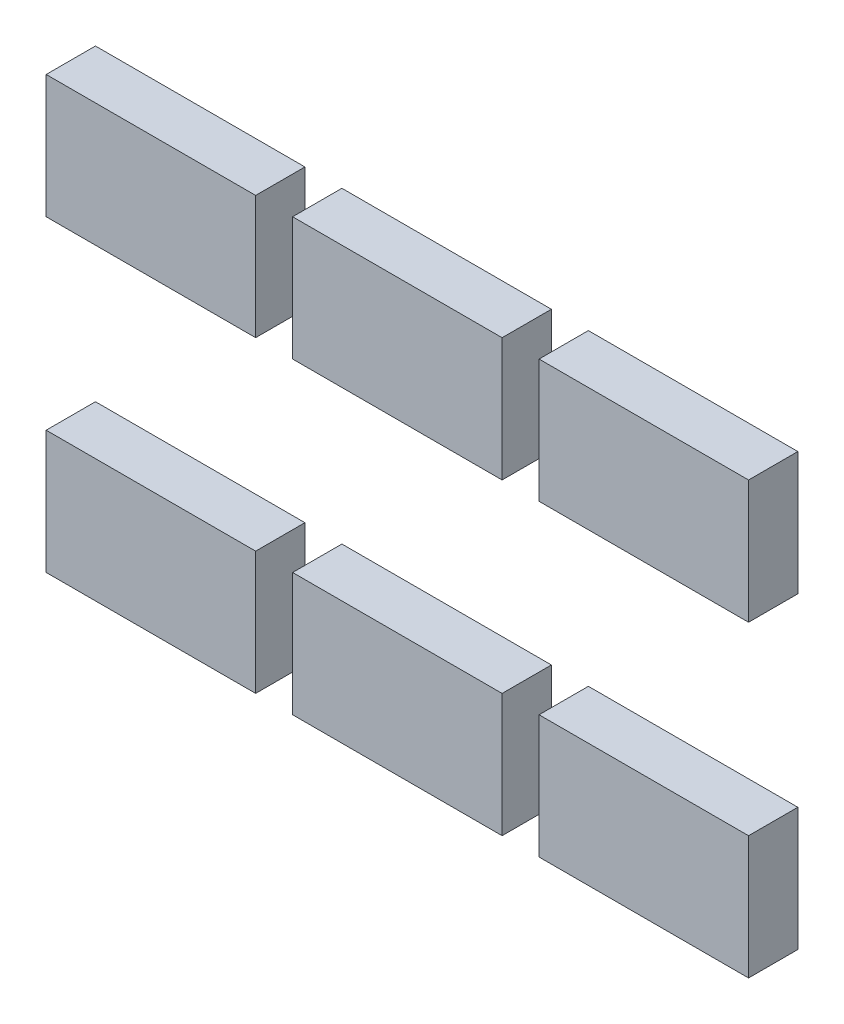
ISO-10303-21;
HEADER;
FILE_DESCRIPTION(('STEP AP214'),'2;1');
FILE_NAME('part.step','',(''),(''),'','','');
FILE_SCHEMA(('AUTOMOTIVE_DESIGN { 1 0 10303 214 1 1 1 1 }'));
ENDSEC;
DATA;
#1=APPLICATION_CONTEXT('core data for automotive mechanical design processes');
#2=APPLICATION_PROTOCOL_DEFINITION('international standard','automotive_design',2000,#1);
#3=PRODUCT_CONTEXT('',#1,'mechanical');
#4=PRODUCT('Part','Part','',(#3));
#5=PRODUCT_RELATED_PRODUCT_CATEGORY('part','',(#4));
#6=PRODUCT_DEFINITION_FORMATION('','',#4);
#7=PRODUCT_DEFINITION_CONTEXT('part definition',#1,'design');
#8=PRODUCT_DEFINITION('design','',#6,#7);
#9=PRODUCT_DEFINITION_SHAPE('','',#8);
#10=(LENGTH_UNIT() NAMED_UNIT(*) SI_UNIT(.MILLI.,.METRE.));
#11=(NAMED_UNIT(*) PLANE_ANGLE_UNIT() SI_UNIT($,.RADIAN.));
#12=(NAMED_UNIT(*) SI_UNIT($,.STERADIAN.) SOLID_ANGLE_UNIT());
#13=UNCERTAINTY_MEASURE_WITH_UNIT(LENGTH_MEASURE(1.E-05),#10,'distance_accuracy_value','');
#14=(GEOMETRIC_REPRESENTATION_CONTEXT(3) GLOBAL_UNCERTAINTY_ASSIGNED_CONTEXT((#13)) GLOBAL_UNIT_ASSIGNED_CONTEXT((#10,
#11,#12)) REPRESENTATION_CONTEXT('',''));
#15=CARTESIAN_POINT('',(0.,0.,0.));
#16=DIRECTION('',(0.,0.,1.));
#17=DIRECTION('',(1.,0.,0.));
#18=AXIS2_PLACEMENT_3D('',#15,#16,#17);
#19=CARTESIAN_POINT('',(-1.70000000000002,6.,0.8));
#20=DIRECTION('',(0.,-1.,0.));
#21=DIRECTION('',(0.,0.,-1.));
#22=AXIS2_PLACEMENT_3D('',#19,#20,#21);
#23=PLANE('',#22);
#24=DIRECTION('',(-1.,0.,0.));
#25=VECTOR('',#24,1.);
#26=CARTESIAN_POINT('',(-1.70000000000002,6.,0.));
#27=LINE('',#26,#25);
#28=CARTESIAN_POINT('',(1.69999999999998,6.,0.));
#29=VERTEX_POINT('',#28);
#30=CARTESIAN_POINT('',(-1.70000000000002,6.,0.));
#31=VERTEX_POINT('',#30);
#32=EDGE_CURVE('E113',#29,#31,#27,.T.);
#33=ORIENTED_EDGE('',*,*,#32,.T.);
#34=DIRECTION('',(0.,0.,-1.));
#35=VECTOR('',#34,1.);
#36=CARTESIAN_POINT('',(-1.70000000000002,6.,0.8));
#37=LINE('',#36,#35);
#38=CARTESIAN_POINT('',(-1.70000000000002,6.,0.8));
#39=VERTEX_POINT('',#38);
#40=EDGE_CURVE('E12',#39,#31,#37,.T.);
#41=ORIENTED_EDGE('',*,*,#40,.F.);
#42=DIRECTION('',(-1.,0.,0.));
#43=VECTOR('',#42,1.);
#44=CARTESIAN_POINT('',(-1.70000000000002,6.,0.8));
#45=LINE('',#44,#43);
#46=CARTESIAN_POINT('',(1.69999999999998,6.,0.8));
#47=VERTEX_POINT('',#46);
#48=EDGE_CURVE('E101',#47,#39,#45,.T.);
#49=ORIENTED_EDGE('',*,*,#48,.F.);
#50=DIRECTION('',(0.,0.,-1.));
#51=VECTOR('',#50,1.);
#52=CARTESIAN_POINT('',(1.69999999999998,6.,0.8));
#53=LINE('',#52,#51);
#54=EDGE_CURVE('E109',#47,#29,#53,.T.);
#55=ORIENTED_EDGE('',*,*,#54,.T.);
#56=EDGE_LOOP('',(#33,#41,#49,#55));
#57=FACE_BOUND('',#56,.T.);
#58=ADVANCED_FACE('F50',(#57),#23,.F.);
#59=CARTESIAN_POINT('',(-1.70000000000002,4.,0.8));
#60=DIRECTION('',(1.,0.,0.));
#61=DIRECTION('',(0.,0.,-1.));
#62=AXIS2_PLACEMENT_3D('',#59,#60,#61);
#63=PLANE('',#62);
#64=DIRECTION('',(0.,-1.,0.));
#65=VECTOR('',#64,1.);
#66=CARTESIAN_POINT('',(-1.70000000000002,4.,0.));
#67=LINE('',#66,#65);
#68=CARTESIAN_POINT('',(-1.70000000000002,4.,0.));
#69=VERTEX_POINT('',#68);
#70=EDGE_CURVE('E105',#31,#69,#67,.T.);
#71=ORIENTED_EDGE('',*,*,#70,.T.);
#72=DIRECTION('',(0.,0.,-1.));
#73=VECTOR('',#72,1.);
#74=CARTESIAN_POINT('',(-1.70000000000002,4.,0.8));
#75=LINE('',#74,#73);
#76=CARTESIAN_POINT('',(-1.70000000000002,4.,0.8));
#77=VERTEX_POINT('',#76);
#78=EDGE_CURVE('E58',#77,#69,#75,.T.);
#79=ORIENTED_EDGE('',*,*,#78,.F.);
#80=DIRECTION('',(0.,-1.,0.));
#81=VECTOR('',#80,1.);
#82=CARTESIAN_POINT('',(-1.70000000000002,4.,0.8));
#83=LINE('',#82,#81);
#84=EDGE_CURVE('E96',#39,#77,#83,.T.);
#85=ORIENTED_EDGE('',*,*,#84,.F.);
#86=ORIENTED_EDGE('',*,*,#40,.T.);
#87=EDGE_LOOP('',(#71,#79,#85,#86));
#88=FACE_BOUND('',#87,.T.);
#89=ADVANCED_FACE('F104',(#88),#63,.F.);
#90=CARTESIAN_POINT('',(-1.70000000000002,4.,0.8));
#91=DIRECTION('',(0.,1.,0.));
#92=DIRECTION('',(0.,0.,1.));
#93=AXIS2_PLACEMENT_3D('',#90,#91,#92);
#94=PLANE('',#93);
#95=DIRECTION('',(1.,0.,0.));
#96=VECTOR('',#95,1.);
#97=CARTESIAN_POINT('',(-1.70000000000002,4.,0.));
#98=LINE('',#97,#96);
#99=CARTESIAN_POINT('',(1.69999999999998,4.,0.));
#100=VERTEX_POINT('',#99);
#101=EDGE_CURVE('E83',#69,#100,#98,.T.);
#102=ORIENTED_EDGE('',*,*,#101,.T.);
#103=DIRECTION('',(0.,0.,-1.));
#104=VECTOR('',#103,1.);
#105=CARTESIAN_POINT('',(1.69999999999998,4.,0.8));
#106=LINE('',#105,#104);
#107=CARTESIAN_POINT('',(1.69999999999998,4.,0.8));
#108=VERTEX_POINT('',#107);
#109=EDGE_CURVE('E106',#108,#100,#106,.T.);
#110=ORIENTED_EDGE('',*,*,#109,.F.);
#111=DIRECTION('',(1.,0.,0.));
#112=VECTOR('',#111,1.);
#113=CARTESIAN_POINT('',(-1.70000000000002,4.,0.8));
#114=LINE('',#113,#112);
#115=EDGE_CURVE('E99',#77,#108,#114,.T.);
#116=ORIENTED_EDGE('',*,*,#115,.F.);
#117=ORIENTED_EDGE('',*,*,#78,.T.);
#118=EDGE_LOOP('',(#102,#110,#116,#117));
#119=FACE_BOUND('',#118,.T.);
#120=ADVANCED_FACE('F107',(#119),#94,.F.);
#121=CARTESIAN_POINT('',(1.69999999999998,4.,0.8));
#122=DIRECTION('',(-1.,0.,0.));
#123=DIRECTION('',(0.,0.,1.));
#124=AXIS2_PLACEMENT_3D('',#121,#122,#123);
#125=PLANE('',#124);
#126=DIRECTION('',(0.,1.,0.));
#127=VECTOR('',#126,1.);
#128=CARTESIAN_POINT('',(1.69999999999998,4.,0.));
#129=LINE('',#128,#127);
#130=EDGE_CURVE('E89',#100,#29,#129,.T.);
#131=ORIENTED_EDGE('',*,*,#130,.T.);
#132=ORIENTED_EDGE('',*,*,#54,.F.);
#133=DIRECTION('',(0.,1.,0.));
#134=VECTOR('',#133,1.);
#135=CARTESIAN_POINT('',(1.69999999999998,4.,0.8));
#136=LINE('',#135,#134);
#137=EDGE_CURVE('E66',#108,#47,#136,.T.);
#138=ORIENTED_EDGE('',*,*,#137,.F.);
#139=ORIENTED_EDGE('',*,*,#109,.T.);
#140=EDGE_LOOP('',(#131,#132,#138,#139));
#141=FACE_BOUND('',#140,.T.);
#142=ADVANCED_FACE('F120',(#141),#125,.F.);
#143=CARTESIAN_POINT('',(0.,0.,0.8));
#144=DIRECTION('',(0.,0.,1.));
#145=DIRECTION('',(1.,0.,0.));
#146=AXIS2_PLACEMENT_3D('',#143,#144,#145);
#147=PLANE('',#146);
#148=ORIENTED_EDGE('',*,*,#48,.T.);
#149=ORIENTED_EDGE('',*,*,#84,.T.);
#150=ORIENTED_EDGE('',*,*,#115,.T.);
#151=ORIENTED_EDGE('',*,*,#137,.T.);
#152=EDGE_LOOP('',(#148,#149,#150,#151));
#153=FACE_BOUND('',#152,.T.);
#154=ADVANCED_FACE('F97',(#153),#147,.T.);
#155=CARTESIAN_POINT('',(0.,0.,0.));
#156=DIRECTION('',(0.,0.,1.));
#157=DIRECTION('',(1.,0.,0.));
#158=AXIS2_PLACEMENT_3D('',#155,#156,#157);
#159=PLANE('',#158);
#160=ORIENTED_EDGE('',*,*,#32,.F.);
#161=ORIENTED_EDGE('',*,*,#130,.F.);
#162=ORIENTED_EDGE('',*,*,#101,.F.);
#163=ORIENTED_EDGE('',*,*,#70,.F.);
#164=EDGE_LOOP('',(#160,#161,#162,#163));
#165=FACE_BOUND('',#164,.T.);
#166=ADVANCED_FACE('F123',(#165),#159,.F.);
#167=CLOSED_SHELL('',(#58,#89,#120,#142,#154,#166));
#168=MANIFOLD_SOLID_BREP('B2',#167);
#169=CARTESIAN_POINT('',(6.29999999999998,6.,0.8));
#170=DIRECTION('',(0.,-1.,0.));
#171=DIRECTION('',(0.,0.,-1.));
#172=AXIS2_PLACEMENT_3D('',#169,#170,#171);
#173=PLANE('',#172);
#174=DIRECTION('',(-1.,0.,0.));
#175=VECTOR('',#174,1.);
#176=CARTESIAN_POINT('',(6.29999999999998,6.,0.));
#177=LINE('',#176,#175);
#178=CARTESIAN_POINT('',(9.69999999999998,6.,0.));
#179=VERTEX_POINT('',#178);
#180=CARTESIAN_POINT('',(6.29999999999998,6.,0.));
#181=VERTEX_POINT('',#180);
#182=EDGE_CURVE('E247',#179,#181,#177,.T.);
#183=ORIENTED_EDGE('',*,*,#182,.T.);
#184=DIRECTION('',(0.,0.,-1.));
#185=VECTOR('',#184,1.);
#186=CARTESIAN_POINT('',(6.29999999999998,6.,0.8));
#187=LINE('',#186,#185);
#188=CARTESIAN_POINT('',(6.29999999999998,6.,0.8));
#189=VERTEX_POINT('',#188);
#190=EDGE_CURVE('E48',#189,#181,#187,.T.);
#191=ORIENTED_EDGE('',*,*,#190,.F.);
#192=DIRECTION('',(-1.,0.,0.));
#193=VECTOR('',#192,1.);
#194=CARTESIAN_POINT('',(6.29999999999998,6.,0.8));
#195=LINE('',#194,#193);
#196=CARTESIAN_POINT('',(9.69999999999998,6.,0.8));
#197=VERTEX_POINT('',#196);
#198=EDGE_CURVE('E235',#197,#189,#195,.T.);
#199=ORIENTED_EDGE('',*,*,#198,.F.);
#200=DIRECTION('',(0.,0.,-1.));
#201=VECTOR('',#200,1.);
#202=CARTESIAN_POINT('',(9.69999999999998,6.,0.8));
#203=LINE('',#202,#201);
#204=EDGE_CURVE('E243',#197,#179,#203,.T.);
#205=ORIENTED_EDGE('',*,*,#204,.T.);
#206=EDGE_LOOP('',(#183,#191,#199,#205));
#207=FACE_BOUND('',#206,.T.);
#208=ADVANCED_FACE('F184',(#207),#173,.F.);
#209=CARTESIAN_POINT('',(6.29999999999998,4.,0.8));
#210=DIRECTION('',(1.,0.,0.));
#211=DIRECTION('',(0.,0.,-1.));
#212=AXIS2_PLACEMENT_3D('',#209,#210,#211);
#213=PLANE('',#212);
#214=DIRECTION('',(0.,-1.,0.));
#215=VECTOR('',#214,1.);
#216=CARTESIAN_POINT('',(6.29999999999998,4.,0.));
#217=LINE('',#216,#215);
#218=CARTESIAN_POINT('',(6.29999999999998,4.,0.));
#219=VERTEX_POINT('',#218);
#220=EDGE_CURVE('E239',#181,#219,#217,.T.);
#221=ORIENTED_EDGE('',*,*,#220,.T.);
#222=DIRECTION('',(0.,0.,-1.));
#223=VECTOR('',#222,1.);
#224=CARTESIAN_POINT('',(6.29999999999998,4.,0.8));
#225=LINE('',#224,#223);
#226=CARTESIAN_POINT('',(6.29999999999998,4.,0.8));
#227=VERTEX_POINT('',#226);
#228=EDGE_CURVE('E192',#227,#219,#225,.T.);
#229=ORIENTED_EDGE('',*,*,#228,.F.);
#230=DIRECTION('',(0.,-1.,0.));
#231=VECTOR('',#230,1.);
#232=CARTESIAN_POINT('',(6.29999999999998,4.,0.8));
#233=LINE('',#232,#231);
#234=EDGE_CURVE('E230',#189,#227,#233,.T.);
#235=ORIENTED_EDGE('',*,*,#234,.F.);
#236=ORIENTED_EDGE('',*,*,#190,.T.);
#237=EDGE_LOOP('',(#221,#229,#235,#236));
#238=FACE_BOUND('',#237,.T.);
#239=ADVANCED_FACE('F238',(#238),#213,.F.);
#240=CARTESIAN_POINT('',(6.29999999999998,4.,0.8));
#241=DIRECTION('',(0.,1.,0.));
#242=DIRECTION('',(0.,0.,1.));
#243=AXIS2_PLACEMENT_3D('',#240,#241,#242);
#244=PLANE('',#243);
#245=DIRECTION('',(1.,0.,0.));
#246=VECTOR('',#245,1.);
#247=CARTESIAN_POINT('',(6.29999999999998,4.,0.));
#248=LINE('',#247,#246);
#249=CARTESIAN_POINT('',(9.69999999999998,4.,0.));
#250=VERTEX_POINT('',#249);
#251=EDGE_CURVE('E217',#219,#250,#248,.T.);
#252=ORIENTED_EDGE('',*,*,#251,.T.);
#253=DIRECTION('',(0.,0.,-1.));
#254=VECTOR('',#253,1.);
#255=CARTESIAN_POINT('',(9.69999999999998,4.,0.8));
#256=LINE('',#255,#254);
#257=CARTESIAN_POINT('',(9.69999999999998,4.,0.8));
#258=VERTEX_POINT('',#257);
#259=EDGE_CURVE('E240',#258,#250,#256,.T.);
#260=ORIENTED_EDGE('',*,*,#259,.F.);
#261=DIRECTION('',(1.,0.,0.));
#262=VECTOR('',#261,1.);
#263=CARTESIAN_POINT('',(6.29999999999998,4.,0.8));
#264=LINE('',#263,#262);
#265=EDGE_CURVE('E233',#227,#258,#264,.T.);
#266=ORIENTED_EDGE('',*,*,#265,.F.);
#267=ORIENTED_EDGE('',*,*,#228,.T.);
#268=EDGE_LOOP('',(#252,#260,#266,#267));
#269=FACE_BOUND('',#268,.T.);
#270=ADVANCED_FACE('F241',(#269),#244,.F.);
#271=CARTESIAN_POINT('',(9.69999999999998,4.,0.8));
#272=DIRECTION('',(-1.,0.,0.));
#273=DIRECTION('',(0.,0.,1.));
#274=AXIS2_PLACEMENT_3D('',#271,#272,#273);
#275=PLANE('',#274);
#276=DIRECTION('',(0.,1.,0.));
#277=VECTOR('',#276,1.);
#278=CARTESIAN_POINT('',(9.69999999999998,4.,0.));
#279=LINE('',#278,#277);
#280=EDGE_CURVE('E223',#250,#179,#279,.T.);
#281=ORIENTED_EDGE('',*,*,#280,.T.);
#282=ORIENTED_EDGE('',*,*,#204,.F.);
#283=DIRECTION('',(0.,1.,0.));
#284=VECTOR('',#283,1.);
#285=CARTESIAN_POINT('',(9.69999999999998,4.,0.8));
#286=LINE('',#285,#284);
#287=EDGE_CURVE('E200',#258,#197,#286,.T.);
#288=ORIENTED_EDGE('',*,*,#287,.F.);
#289=ORIENTED_EDGE('',*,*,#259,.T.);
#290=EDGE_LOOP('',(#281,#282,#288,#289));
#291=FACE_BOUND('',#290,.T.);
#292=ADVANCED_FACE('F254',(#291),#275,.F.);
#293=CARTESIAN_POINT('',(0.,0.,0.8));
#294=DIRECTION('',(0.,0.,1.));
#295=DIRECTION('',(1.,0.,0.));
#296=AXIS2_PLACEMENT_3D('',#293,#294,#295);
#297=PLANE('',#296);
#298=ORIENTED_EDGE('',*,*,#198,.T.);
#299=ORIENTED_EDGE('',*,*,#234,.T.);
#300=ORIENTED_EDGE('',*,*,#265,.T.);
#301=ORIENTED_EDGE('',*,*,#287,.T.);
#302=EDGE_LOOP('',(#298,#299,#300,#301));
#303=FACE_BOUND('',#302,.T.);
#304=ADVANCED_FACE('F231',(#303),#297,.T.);
#305=CARTESIAN_POINT('',(0.,0.,0.));
#306=DIRECTION('',(0.,0.,1.));
#307=DIRECTION('',(1.,0.,0.));
#308=AXIS2_PLACEMENT_3D('',#305,#306,#307);
#309=PLANE('',#308);
#310=ORIENTED_EDGE('',*,*,#182,.F.);
#311=ORIENTED_EDGE('',*,*,#280,.F.);
#312=ORIENTED_EDGE('',*,*,#251,.F.);
#313=ORIENTED_EDGE('',*,*,#220,.F.);
#314=EDGE_LOOP('',(#310,#311,#312,#313));
#315=FACE_BOUND('',#314,.T.);
#316=ADVANCED_FACE('F257',(#315),#309,.F.);
#317=CLOSED_SHELL('',(#208,#239,#270,#292,#304,#316));
#318=MANIFOLD_SOLID_BREP('B6',#317);
#319=CARTESIAN_POINT('',(2.29999999999998,6.,0.8));
#320=DIRECTION('',(0.,-1.,0.));
#321=DIRECTION('',(0.,0.,-1.));
#322=AXIS2_PLACEMENT_3D('',#319,#320,#321);
#323=PLANE('',#322);
#324=DIRECTION('',(-1.,0.,0.));
#325=VECTOR('',#324,1.);
#326=CARTESIAN_POINT('',(2.29999999999998,6.,0.));
#327=LINE('',#326,#325);
#328=CARTESIAN_POINT('',(5.69999999999998,6.,0.));
#329=VERTEX_POINT('',#328);
#330=CARTESIAN_POINT('',(2.29999999999998,6.,0.));
#331=VERTEX_POINT('',#330);
#332=EDGE_CURVE('E386',#329,#331,#327,.T.);
#333=ORIENTED_EDGE('',*,*,#332,.T.);
#334=DIRECTION('',(0.,0.,-1.));
#335=VECTOR('',#334,1.);
#336=CARTESIAN_POINT('',(2.29999999999998,6.,0.8));
#337=LINE('',#336,#335);
#338=CARTESIAN_POINT('',(2.29999999999998,6.,0.8));
#339=VERTEX_POINT('',#338);
#340=EDGE_CURVE('E182',#339,#331,#337,.T.);
#341=ORIENTED_EDGE('',*,*,#340,.F.);
#342=DIRECTION('',(-1.,0.,0.));
#343=VECTOR('',#342,1.);
#344=CARTESIAN_POINT('',(2.29999999999998,6.,0.8));
#345=LINE('',#344,#343);
#346=CARTESIAN_POINT('',(5.69999999999998,6.,0.8));
#347=VERTEX_POINT('',#346);
#348=EDGE_CURVE('E370',#347,#339,#345,.T.);
#349=ORIENTED_EDGE('',*,*,#348,.F.);
#350=DIRECTION('',(0.,0.,-1.));
#351=VECTOR('',#350,1.);
#352=CARTESIAN_POINT('',(5.69999999999998,6.,0.8));
#353=LINE('',#352,#351);
#354=EDGE_CURVE('E382',#347,#329,#353,.T.);
#355=ORIENTED_EDGE('',*,*,#354,.T.);
#356=EDGE_LOOP('',(#333,#341,#349,#355));
#357=FACE_BOUND('',#356,.T.);
#358=ADVANCED_FACE('F318',(#357),#323,.F.);
#359=CARTESIAN_POINT('',(2.29999999999998,4.,0.8));
#360=DIRECTION('',(1.,0.,0.));
#361=DIRECTION('',(0.,0.,-1.));
#362=AXIS2_PLACEMENT_3D('',#359,#360,#361);
#363=PLANE('',#362);
#364=DIRECTION('',(0.,-1.,0.));
#365=VECTOR('',#364,1.);
#366=CARTESIAN_POINT('',(2.29999999999998,4.,0.));
#367=LINE('',#366,#365);
#368=CARTESIAN_POINT('',(2.29999999999998,4.,0.));
#369=VERTEX_POINT('',#368);
#370=EDGE_CURVE('E375',#331,#369,#367,.T.);
#371=ORIENTED_EDGE('',*,*,#370,.T.);
#372=DIRECTION('',(0.,0.,-1.));
#373=VECTOR('',#372,1.);
#374=CARTESIAN_POINT('',(2.29999999999998,4.,0.8));
#375=LINE('',#374,#373);
#376=CARTESIAN_POINT('',(2.29999999999998,4.,0.8));
#377=VERTEX_POINT('',#376);
#378=EDGE_CURVE('E327',#377,#369,#375,.T.);
#379=ORIENTED_EDGE('',*,*,#378,.F.);
#380=DIRECTION('',(0.,-1.,0.));
#381=VECTOR('',#380,1.);
#382=CARTESIAN_POINT('',(2.29999999999998,4.,0.8));
#383=LINE('',#382,#381);
#384=EDGE_CURVE('E365',#339,#377,#383,.T.);
#385=ORIENTED_EDGE('',*,*,#384,.F.);
#386=ORIENTED_EDGE('',*,*,#340,.T.);
#387=EDGE_LOOP('',(#371,#379,#385,#386));
#388=FACE_BOUND('',#387,.T.);
#389=ADVANCED_FACE('F374',(#388),#363,.F.);
#390=CARTESIAN_POINT('',(2.29999999999998,4.,0.8));
#391=DIRECTION('',(0.,1.,0.));
#392=DIRECTION('',(0.,0.,1.));
#393=AXIS2_PLACEMENT_3D('',#390,#391,#392);
#394=PLANE('',#393);
#395=DIRECTION('',(1.,0.,0.));
#396=VECTOR('',#395,1.);
#397=CARTESIAN_POINT('',(2.29999999999998,4.,0.));
#398=LINE('',#397,#396);
#399=CARTESIAN_POINT('',(5.69999999999998,4.,0.));
#400=VERTEX_POINT('',#399);
#401=EDGE_CURVE('E352',#369,#400,#398,.T.);
#402=ORIENTED_EDGE('',*,*,#401,.T.);
#403=DIRECTION('',(0.,0.,-1.));
#404=VECTOR('',#403,1.);
#405=CARTESIAN_POINT('',(5.69999999999998,4.,0.8));
#406=LINE('',#405,#404);
#407=CARTESIAN_POINT('',(5.69999999999998,4.,0.8));
#408=VERTEX_POINT('',#407);
#409=EDGE_CURVE('E377',#408,#400,#406,.T.);
#410=ORIENTED_EDGE('',*,*,#409,.F.);
#411=DIRECTION('',(1.,0.,0.));
#412=VECTOR('',#411,1.);
#413=CARTESIAN_POINT('',(2.29999999999998,4.,0.8));
#414=LINE('',#413,#412);
#415=EDGE_CURVE('E368',#377,#408,#414,.T.);
#416=ORIENTED_EDGE('',*,*,#415,.F.);
#417=ORIENTED_EDGE('',*,*,#378,.T.);
#418=EDGE_LOOP('',(#402,#410,#416,#417));
#419=FACE_BOUND('',#418,.T.);
#420=ADVANCED_FACE('F378',(#419),#394,.F.);
#421=CARTESIAN_POINT('',(5.69999999999998,4.,0.8));
#422=DIRECTION('',(-1.,0.,0.));
#423=DIRECTION('',(0.,0.,1.));
#424=AXIS2_PLACEMENT_3D('',#421,#422,#423);
#425=PLANE('',#424);
#426=DIRECTION('',(0.,1.,0.));
#427=VECTOR('',#426,1.);
#428=CARTESIAN_POINT('',(5.69999999999998,4.,0.));
#429=LINE('',#428,#427);
#430=EDGE_CURVE('E358',#400,#329,#429,.T.);
#431=ORIENTED_EDGE('',*,*,#430,.T.);
#432=ORIENTED_EDGE('',*,*,#354,.F.);
#433=DIRECTION('',(0.,1.,0.));
#434=VECTOR('',#433,1.);
#435=CARTESIAN_POINT('',(5.69999999999998,4.,0.8));
#436=LINE('',#435,#434);
#437=EDGE_CURVE('E335',#408,#347,#436,.T.);
#438=ORIENTED_EDGE('',*,*,#437,.F.);
#439=ORIENTED_EDGE('',*,*,#409,.T.);
#440=EDGE_LOOP('',(#431,#432,#438,#439));
#441=FACE_BOUND('',#440,.T.);
#442=ADVANCED_FACE('F399',(#441),#425,.F.);
#443=CARTESIAN_POINT('',(0.,0.,0.8));
#444=DIRECTION('',(0.,0.,1.));
#445=DIRECTION('',(1.,0.,0.));
#446=AXIS2_PLACEMENT_3D('',#443,#444,#445);
#447=PLANE('',#446);
#448=ORIENTED_EDGE('',*,*,#348,.T.);
#449=ORIENTED_EDGE('',*,*,#384,.T.);
#450=ORIENTED_EDGE('',*,*,#415,.T.);
#451=ORIENTED_EDGE('',*,*,#437,.T.);
#452=EDGE_LOOP('',(#448,#449,#450,#451));
#453=FACE_BOUND('',#452,.T.);
#454=ADVANCED_FACE('F366',(#453),#447,.T.);
#455=CARTESIAN_POINT('',(0.,0.,0.));
#456=DIRECTION('',(0.,0.,1.));
#457=DIRECTION('',(1.,0.,0.));
#458=AXIS2_PLACEMENT_3D('',#455,#456,#457);
#459=PLANE('',#458);
#460=ORIENTED_EDGE('',*,*,#332,.F.);
#461=ORIENTED_EDGE('',*,*,#430,.F.);
#462=ORIENTED_EDGE('',*,*,#401,.F.);
#463=ORIENTED_EDGE('',*,*,#370,.F.);
#464=EDGE_LOOP('',(#460,#461,#462,#463));
#465=FACE_BOUND('',#464,.T.);
#466=ADVANCED_FACE('F402',(#465),#459,.F.);
#467=CLOSED_SHELL('',(#358,#389,#420,#442,#454,#466));
#468=MANIFOLD_SOLID_BREP('B42',#467);
#469=CARTESIAN_POINT('',(6.3,1.,0.8));
#470=DIRECTION('',(0.,-1.,0.));
#471=DIRECTION('',(0.,0.,-1.));
#472=AXIS2_PLACEMENT_3D('',#469,#470,#471);
#473=PLANE('',#472);
#474=DIRECTION('',(-1.,0.,0.));
#475=VECTOR('',#474,1.);
#476=CARTESIAN_POINT('',(6.3,1.,0.));
#477=LINE('',#476,#475);
#478=CARTESIAN_POINT('',(9.7,1.,0.));
#479=VERTEX_POINT('',#478);
#480=CARTESIAN_POINT('',(6.3,1.,0.));
#481=VERTEX_POINT('',#480);
#482=EDGE_CURVE('E527',#479,#481,#477,.T.);
#483=ORIENTED_EDGE('',*,*,#482,.T.);
#484=DIRECTION('',(0.,0.,-1.));
#485=VECTOR('',#484,1.);
#486=CARTESIAN_POINT('',(6.3,1.,0.8));
#487=LINE('',#486,#485);
#488=CARTESIAN_POINT('',(6.3,1.,0.8));
#489=VERTEX_POINT('',#488);
#490=EDGE_CURVE('E316',#489,#481,#487,.T.);
#491=ORIENTED_EDGE('',*,*,#490,.F.);
#492=DIRECTION('',(-1.,0.,0.));
#493=VECTOR('',#492,1.);
#494=CARTESIAN_POINT('',(6.3,1.,0.8));
#495=LINE('',#494,#493);
#496=CARTESIAN_POINT('',(9.7,1.,0.8));
#497=VERTEX_POINT('',#496);
#498=EDGE_CURVE('E515',#497,#489,#495,.T.);
#499=ORIENTED_EDGE('',*,*,#498,.F.);
#500=DIRECTION('',(0.,0.,-1.));
#501=VECTOR('',#500,1.);
#502=CARTESIAN_POINT('',(9.7,1.,0.8));
#503=LINE('',#502,#501);
#504=EDGE_CURVE('E523',#497,#479,#503,.T.);
#505=ORIENTED_EDGE('',*,*,#504,.T.);
#506=EDGE_LOOP('',(#483,#491,#499,#505));
#507=FACE_BOUND('',#506,.T.);
#508=ADVANCED_FACE('F464',(#507),#473,.F.);
#509=CARTESIAN_POINT('',(6.3,-1.,0.8));
#510=DIRECTION('',(1.,0.,0.));
#511=DIRECTION('',(0.,0.,-1.));
#512=AXIS2_PLACEMENT_3D('',#509,#510,#511);
#513=PLANE('',#512);
#514=DIRECTION('',(0.,-1.,0.));
#515=VECTOR('',#514,1.);
#516=CARTESIAN_POINT('',(6.3,-1.,0.));
#517=LINE('',#516,#515);
#518=CARTESIAN_POINT('',(6.3,-1.,0.));
#519=VERTEX_POINT('',#518);
#520=EDGE_CURVE('E519',#481,#519,#517,.T.);
#521=ORIENTED_EDGE('',*,*,#520,.T.);
#522=DIRECTION('',(0.,0.,-1.));
#523=VECTOR('',#522,1.);
#524=CARTESIAN_POINT('',(6.3,-1.,0.8));
#525=LINE('',#524,#523);
#526=CARTESIAN_POINT('',(6.3,-1.,0.8));
#527=VERTEX_POINT('',#526);
#528=EDGE_CURVE('E472',#527,#519,#525,.T.);
#529=ORIENTED_EDGE('',*,*,#528,.F.);
#530=DIRECTION('',(0.,-1.,0.));
#531=VECTOR('',#530,1.);
#532=CARTESIAN_POINT('',(6.3,-1.,0.8));
#533=LINE('',#532,#531);
#534=EDGE_CURVE('E510',#489,#527,#533,.T.);
#535=ORIENTED_EDGE('',*,*,#534,.F.);
#536=ORIENTED_EDGE('',*,*,#490,.T.);
#537=EDGE_LOOP('',(#521,#529,#535,#536));
#538=FACE_BOUND('',#537,.T.);
#539=ADVANCED_FACE('F518',(#538),#513,.F.);
#540=CARTESIAN_POINT('',(6.3,-1.,0.8));
#541=DIRECTION('',(0.,1.,0.));
#542=DIRECTION('',(0.,0.,1.));
#543=AXIS2_PLACEMENT_3D('',#540,#541,#542);
#544=PLANE('',#543);
#545=DIRECTION('',(1.,0.,0.));
#546=VECTOR('',#545,1.);
#547=CARTESIAN_POINT('',(6.3,-1.,0.));
#548=LINE('',#547,#546);
#549=CARTESIAN_POINT('',(9.7,-1.,0.));
#550=VERTEX_POINT('',#549);
#551=EDGE_CURVE('E497',#519,#550,#548,.T.);
#552=ORIENTED_EDGE('',*,*,#551,.T.);
#553=DIRECTION('',(0.,0.,-1.));
#554=VECTOR('',#553,1.);
#555=CARTESIAN_POINT('',(9.7,-1.,0.8));
#556=LINE('',#555,#554);
#557=CARTESIAN_POINT('',(9.7,-1.,0.8));
#558=VERTEX_POINT('',#557);
#559=EDGE_CURVE('E520',#558,#550,#556,.T.);
#560=ORIENTED_EDGE('',*,*,#559,.F.);
#561=DIRECTION('',(1.,0.,0.));
#562=VECTOR('',#561,1.);
#563=CARTESIAN_POINT('',(6.3,-1.,0.8));
#564=LINE('',#563,#562);
#565=EDGE_CURVE('E513',#527,#558,#564,.T.);
#566=ORIENTED_EDGE('',*,*,#565,.F.);
#567=ORIENTED_EDGE('',*,*,#528,.T.);
#568=EDGE_LOOP('',(#552,#560,#566,#567));
#569=FACE_BOUND('',#568,.T.);
#570=ADVANCED_FACE('F521',(#569),#544,.F.);
#571=CARTESIAN_POINT('',(9.7,-1.,0.8));
#572=DIRECTION('',(-1.,0.,0.));
#573=DIRECTION('',(0.,0.,1.));
#574=AXIS2_PLACEMENT_3D('',#571,#572,#573);
#575=PLANE('',#574);
#576=DIRECTION('',(0.,1.,0.));
#577=VECTOR('',#576,1.);
#578=CARTESIAN_POINT('',(9.7,-1.,0.));
#579=LINE('',#578,#577);
#580=EDGE_CURVE('E503',#550,#479,#579,.T.);
#581=ORIENTED_EDGE('',*,*,#580,.T.);
#582=ORIENTED_EDGE('',*,*,#504,.F.);
#583=DIRECTION('',(0.,1.,0.));
#584=VECTOR('',#583,1.);
#585=CARTESIAN_POINT('',(9.7,-1.,0.8));
#586=LINE('',#585,#584);
#587=EDGE_CURVE('E480',#558,#497,#586,.T.);
#588=ORIENTED_EDGE('',*,*,#587,.F.);
#589=ORIENTED_EDGE('',*,*,#559,.T.);
#590=EDGE_LOOP('',(#581,#582,#588,#589));
#591=FACE_BOUND('',#590,.T.);
#592=ADVANCED_FACE('F534',(#591),#575,.F.);
#593=CARTESIAN_POINT('',(0.,0.,0.8));
#594=DIRECTION('',(0.,0.,1.));
#595=DIRECTION('',(1.,0.,0.));
#596=AXIS2_PLACEMENT_3D('',#593,#594,#595);
#597=PLANE('',#596);
#598=ORIENTED_EDGE('',*,*,#498,.T.);
#599=ORIENTED_EDGE('',*,*,#534,.T.);
#600=ORIENTED_EDGE('',*,*,#565,.T.);
#601=ORIENTED_EDGE('',*,*,#587,.T.);
#602=EDGE_LOOP('',(#598,#599,#600,#601));
#603=FACE_BOUND('',#602,.T.);
#604=ADVANCED_FACE('F511',(#603),#597,.T.);
#605=CARTESIAN_POINT('',(0.,0.,0.));
#606=DIRECTION('',(0.,0.,1.));
#607=DIRECTION('',(1.,0.,0.));
#608=AXIS2_PLACEMENT_3D('',#605,#606,#607);
#609=PLANE('',#608);
#610=ORIENTED_EDGE('',*,*,#482,.F.);
#611=ORIENTED_EDGE('',*,*,#580,.F.);
#612=ORIENTED_EDGE('',*,*,#551,.F.);
#613=ORIENTED_EDGE('',*,*,#520,.F.);
#614=EDGE_LOOP('',(#610,#611,#612,#613));
#615=FACE_BOUND('',#614,.T.);
#616=ADVANCED_FACE('F537',(#615),#609,.F.);
#617=CLOSED_SHELL('',(#508,#539,#570,#592,#604,#616));
#618=MANIFOLD_SOLID_BREP('B176',#617);
#619=CARTESIAN_POINT('',(2.3,1.,0.8));
#620=DIRECTION('',(0.,-1.,0.));
#621=DIRECTION('',(0.,0.,-1.));
#622=AXIS2_PLACEMENT_3D('',#619,#620,#621);
#623=PLANE('',#622);
#624=DIRECTION('',(-1.,0.,0.));
#625=VECTOR('',#624,1.);
#626=CARTESIAN_POINT('',(2.3,1.,0.));
#627=LINE('',#626,#625);
#628=CARTESIAN_POINT('',(5.7,1.,0.));
#629=VERTEX_POINT('',#628);
#630=CARTESIAN_POINT('',(2.3,1.,0.));
#631=VERTEX_POINT('',#630);
#632=EDGE_CURVE('E660',#629,#631,#627,.T.);
#633=ORIENTED_EDGE('',*,*,#632,.T.);
#634=DIRECTION('',(0.,0.,-1.));
#635=VECTOR('',#634,1.);
#636=CARTESIAN_POINT('',(2.3,1.,0.8));
#637=LINE('',#636,#635);
#638=CARTESIAN_POINT('',(2.3,1.,0.8));
#639=VERTEX_POINT('',#638);
#640=EDGE_CURVE('E462',#639,#631,#637,.T.);
#641=ORIENTED_EDGE('',*,*,#640,.F.);
#642=DIRECTION('',(-1.,0.,0.));
#643=VECTOR('',#642,1.);
#644=CARTESIAN_POINT('',(2.3,1.,0.8));
#645=LINE('',#644,#643);
#646=CARTESIAN_POINT('',(5.7,1.,0.8));
#647=VERTEX_POINT('',#646);
#648=EDGE_CURVE('E648',#647,#639,#645,.T.);
#649=ORIENTED_EDGE('',*,*,#648,.F.);
#650=DIRECTION('',(0.,0.,-1.));
#651=VECTOR('',#650,1.);
#652=CARTESIAN_POINT('',(5.7,1.,0.8));
#653=LINE('',#652,#651);
#654=EDGE_CURVE('E656',#647,#629,#653,.T.);
#655=ORIENTED_EDGE('',*,*,#654,.T.);
#656=EDGE_LOOP('',(#633,#641,#649,#655));
#657=FACE_BOUND('',#656,.T.);
#658=ADVANCED_FACE('F597',(#657),#623,.F.);
#659=CARTESIAN_POINT('',(2.3,-1.,0.8));
#660=DIRECTION('',(1.,0.,0.));
#661=DIRECTION('',(0.,0.,-1.));
#662=AXIS2_PLACEMENT_3D('',#659,#660,#661);
#663=PLANE('',#662);
#664=DIRECTION('',(0.,-1.,0.));
#665=VECTOR('',#664,1.);
#666=CARTESIAN_POINT('',(2.3,-1.,0.));
#667=LINE('',#666,#665);
#668=CARTESIAN_POINT('',(2.3,-1.,0.));
#669=VERTEX_POINT('',#668);
#670=EDGE_CURVE('E652',#631,#669,#667,.T.);
#671=ORIENTED_EDGE('',*,*,#670,.T.);
#672=DIRECTION('',(0.,0.,-1.));
#673=VECTOR('',#672,1.);
#674=CARTESIAN_POINT('',(2.3,-1.,0.8));
#675=LINE('',#674,#673);
#676=CARTESIAN_POINT('',(2.3,-1.,0.8));
#677=VERTEX_POINT('',#676);
#678=EDGE_CURVE('E605',#677,#669,#675,.T.);
#679=ORIENTED_EDGE('',*,*,#678,.F.);
#680=DIRECTION('',(0.,-1.,0.));
#681=VECTOR('',#680,1.);
#682=CARTESIAN_POINT('',(2.3,-1.,0.8));
#683=LINE('',#682,#681);
#684=EDGE_CURVE('E643',#639,#677,#683,.T.);
#685=ORIENTED_EDGE('',*,*,#684,.F.);
#686=ORIENTED_EDGE('',*,*,#640,.T.);
#687=EDGE_LOOP('',(#671,#679,#685,#686));
#688=FACE_BOUND('',#687,.T.);
#689=ADVANCED_FACE('F651',(#688),#663,.F.);
#690=CARTESIAN_POINT('',(2.3,-1.,0.8));
#691=DIRECTION('',(0.,1.,0.));
#692=DIRECTION('',(0.,0.,1.));
#693=AXIS2_PLACEMENT_3D('',#690,#691,#692);
#694=PLANE('',#693);
#695=DIRECTION('',(1.,0.,0.));
#696=VECTOR('',#695,1.);
#697=CARTESIAN_POINT('',(2.3,-1.,0.));
#698=LINE('',#697,#696);
#699=CARTESIAN_POINT('',(5.7,-1.,0.));
#700=VERTEX_POINT('',#699);
#701=EDGE_CURVE('E630',#669,#700,#698,.T.);
#702=ORIENTED_EDGE('',*,*,#701,.T.);
#703=DIRECTION('',(0.,0.,-1.));
#704=VECTOR('',#703,1.);
#705=CARTESIAN_POINT('',(5.7,-1.,0.8));
#706=LINE('',#705,#704);
#707=CARTESIAN_POINT('',(5.7,-1.,0.8));
#708=VERTEX_POINT('',#707);
#709=EDGE_CURVE('E653',#708,#700,#706,.T.);
#710=ORIENTED_EDGE('',*,*,#709,.F.);
#711=DIRECTION('',(1.,0.,0.));
#712=VECTOR('',#711,1.);
#713=CARTESIAN_POINT('',(2.3,-1.,0.8));
#714=LINE('',#713,#712);
#715=EDGE_CURVE('E646',#677,#708,#714,.T.);
#716=ORIENTED_EDGE('',*,*,#715,.F.);
#717=ORIENTED_EDGE('',*,*,#678,.T.);
#718=EDGE_LOOP('',(#702,#710,#716,#717));
#719=FACE_BOUND('',#718,.T.);
#720=ADVANCED_FACE('F654',(#719),#694,.F.);
#721=CARTESIAN_POINT('',(5.7,-1.,0.8));
#722=DIRECTION('',(-1.,0.,0.));
#723=DIRECTION('',(0.,0.,1.));
#724=AXIS2_PLACEMENT_3D('',#721,#722,#723);
#725=PLANE('',#724);
#726=DIRECTION('',(0.,1.,0.));
#727=VECTOR('',#726,1.);
#728=CARTESIAN_POINT('',(5.7,-1.,0.));
#729=LINE('',#728,#727);
#730=EDGE_CURVE('E636',#700,#629,#729,.T.);
#731=ORIENTED_EDGE('',*,*,#730,.T.);
#732=ORIENTED_EDGE('',*,*,#654,.F.);
#733=DIRECTION('',(0.,1.,0.));
#734=VECTOR('',#733,1.);
#735=CARTESIAN_POINT('',(5.7,-1.,0.8));
#736=LINE('',#735,#734);
#737=EDGE_CURVE('E613',#708,#647,#736,.T.);
#738=ORIENTED_EDGE('',*,*,#737,.F.);
#739=ORIENTED_EDGE('',*,*,#709,.T.);
#740=EDGE_LOOP('',(#731,#732,#738,#739));
#741=FACE_BOUND('',#740,.T.);
#742=ADVANCED_FACE('F667',(#741),#725,.F.);
#743=CARTESIAN_POINT('',(0.,0.,0.8));
#744=DIRECTION('',(0.,0.,1.));
#745=DIRECTION('',(1.,0.,0.));
#746=AXIS2_PLACEMENT_3D('',#743,#744,#745);
#747=PLANE('',#746);
#748=ORIENTED_EDGE('',*,*,#648,.T.);
#749=ORIENTED_EDGE('',*,*,#684,.T.);
#750=ORIENTED_EDGE('',*,*,#715,.T.);
#751=ORIENTED_EDGE('',*,*,#737,.T.);
#752=EDGE_LOOP('',(#748,#749,#750,#751));
#753=FACE_BOUND('',#752,.T.);
#754=ADVANCED_FACE('F644',(#753),#747,.T.);
#755=CARTESIAN_POINT('',(0.,0.,0.));
#756=DIRECTION('',(0.,0.,1.));
#757=DIRECTION('',(1.,0.,0.));
#758=AXIS2_PLACEMENT_3D('',#755,#756,#757);
#759=PLANE('',#758);
#760=ORIENTED_EDGE('',*,*,#632,.F.);
#761=ORIENTED_EDGE('',*,*,#730,.F.);
#762=ORIENTED_EDGE('',*,*,#701,.F.);
#763=ORIENTED_EDGE('',*,*,#670,.F.);
#764=EDGE_LOOP('',(#760,#761,#762,#763));
#765=FACE_BOUND('',#764,.T.);
#766=ADVANCED_FACE('F670',(#765),#759,.F.);
#767=CLOSED_SHELL('',(#658,#689,#720,#742,#754,#766));
#768=MANIFOLD_SOLID_BREP('B310',#767);
#769=CARTESIAN_POINT('',(1.7,-1.,0.8));
#770=DIRECTION('',(-1.,0.,0.));
#771=DIRECTION('',(0.,0.,1.));
#772=AXIS2_PLACEMENT_3D('',#769,#770,#771);
#773=PLANE('',#772);
#774=DIRECTION('',(0.,1.,0.));
#775=VECTOR('',#774,1.);
#776=CARTESIAN_POINT('',(1.7,-1.,0.));
#777=LINE('',#776,#775);
#778=CARTESIAN_POINT('',(1.7,-1.,0.));
#779=VERTEX_POINT('',#778);
#780=CARTESIAN_POINT('',(1.7,1.,0.));
#781=VERTEX_POINT('',#780);
#782=EDGE_CURVE('E784',#779,#781,#777,.T.);
#783=ORIENTED_EDGE('',*,*,#782,.T.);
#784=DIRECTION('',(0.,0.,-1.));
#785=VECTOR('',#784,1.);
#786=CARTESIAN_POINT('',(1.7,1.,0.8));
#787=LINE('',#786,#785);
#788=CARTESIAN_POINT('',(1.7,1.,0.8));
#789=VERTEX_POINT('',#788);
#790=EDGE_CURVE('E595',#789,#781,#787,.T.);
#791=ORIENTED_EDGE('',*,*,#790,.F.);
#792=DIRECTION('',(0.,1.,0.));
#793=VECTOR('',#792,1.);
#794=CARTESIAN_POINT('',(1.7,-1.,0.8));
#795=LINE('',#794,#793);
#796=CARTESIAN_POINT('',(1.7,-1.,0.8));
#797=VERTEX_POINT('',#796);
#798=EDGE_CURVE('E772',#797,#789,#795,.T.);
#799=ORIENTED_EDGE('',*,*,#798,.F.);
#800=DIRECTION('',(0.,0.,-1.));
#801=VECTOR('',#800,1.);
#802=CARTESIAN_POINT('',(1.7,-1.,0.8));
#803=LINE('',#802,#801);
#804=EDGE_CURVE('E780',#797,#779,#803,.T.);
#805=ORIENTED_EDGE('',*,*,#804,.T.);
#806=EDGE_LOOP('',(#783,#791,#799,#805));
#807=FACE_BOUND('',#806,.T.);
#808=ADVANCED_FACE('F721',(#807),#773,.F.);
#809=CARTESIAN_POINT('',(-1.7,1.,0.8));
#810=DIRECTION('',(0.,-1.,0.));
#811=DIRECTION('',(0.,0.,-1.));
#812=AXIS2_PLACEMENT_3D('',#809,#810,#811);
#813=PLANE('',#812);
#814=DIRECTION('',(-1.,0.,0.));
#815=VECTOR('',#814,1.);
#816=CARTESIAN_POINT('',(-1.7,1.,0.));
#817=LINE('',#816,#815);
#818=CARTESIAN_POINT('',(-1.7,1.,0.));
#819=VERTEX_POINT('',#818);
#820=EDGE_CURVE('E776',#781,#819,#817,.T.);
#821=ORIENTED_EDGE('',*,*,#820,.T.);
#822=DIRECTION('',(0.,0.,-1.));
#823=VECTOR('',#822,1.);
#824=CARTESIAN_POINT('',(-1.7,1.,0.8));
#825=LINE('',#824,#823);
#826=CARTESIAN_POINT('',(-1.7,1.,0.8));
#827=VERTEX_POINT('',#826);
#828=EDGE_CURVE('E729',#827,#819,#825,.T.);
#829=ORIENTED_EDGE('',*,*,#828,.F.);
#830=DIRECTION('',(-1.,0.,0.));
#831=VECTOR('',#830,1.);
#832=CARTESIAN_POINT('',(-1.7,1.,0.8));
#833=LINE('',#832,#831);
#834=EDGE_CURVE('E767',#789,#827,#833,.T.);
#835=ORIENTED_EDGE('',*,*,#834,.F.);
#836=ORIENTED_EDGE('',*,*,#790,.T.);
#837=EDGE_LOOP('',(#821,#829,#835,#836));
#838=FACE_BOUND('',#837,.T.);
#839=ADVANCED_FACE('F775',(#838),#813,.F.);
#840=CARTESIAN_POINT('',(-1.7,-1.,0.8));
#841=DIRECTION('',(1.,0.,0.));
#842=DIRECTION('',(0.,0.,-1.));
#843=AXIS2_PLACEMENT_3D('',#840,#841,#842);
#844=PLANE('',#843);
#845=DIRECTION('',(0.,-1.,0.));
#846=VECTOR('',#845,1.);
#847=CARTESIAN_POINT('',(-1.7,-1.,0.));
#848=LINE('',#847,#846);
#849=CARTESIAN_POINT('',(-1.7,-1.,0.));
#850=VERTEX_POINT('',#849);
#851=EDGE_CURVE('E754',#819,#850,#848,.T.);
#852=ORIENTED_EDGE('',*,*,#851,.T.);
#853=DIRECTION('',(0.,0.,-1.));
#854=VECTOR('',#853,1.);
#855=CARTESIAN_POINT('',(-1.7,-1.,0.8));
#856=LINE('',#855,#854);
#857=CARTESIAN_POINT('',(-1.7,-1.,0.8));
#858=VERTEX_POINT('',#857);
#859=EDGE_CURVE('E777',#858,#850,#856,.T.);
#860=ORIENTED_EDGE('',*,*,#859,.F.);
#861=DIRECTION('',(0.,-1.,0.));
#862=VECTOR('',#861,1.);
#863=CARTESIAN_POINT('',(-1.7,-1.,0.8));
#864=LINE('',#863,#862);
#865=EDGE_CURVE('E770',#827,#858,#864,.T.);
#866=ORIENTED_EDGE('',*,*,#865,.F.);
#867=ORIENTED_EDGE('',*,*,#828,.T.);
#868=EDGE_LOOP('',(#852,#860,#866,#867));
#869=FACE_BOUND('',#868,.T.);
#870=ADVANCED_FACE('F778',(#869),#844,.F.);
#871=CARTESIAN_POINT('',(-1.7,-1.,0.8));
#872=DIRECTION('',(0.,1.,0.));
#873=DIRECTION('',(0.,0.,1.));
#874=AXIS2_PLACEMENT_3D('',#871,#872,#873);
#875=PLANE('',#874);
#876=DIRECTION('',(1.,0.,0.));
#877=VECTOR('',#876,1.);
#878=CARTESIAN_POINT('',(-1.7,-1.,0.));
#879=LINE('',#878,#877);
#880=EDGE_CURVE('E760',#850,#779,#879,.T.);
#881=ORIENTED_EDGE('',*,*,#880,.T.);
#882=ORIENTED_EDGE('',*,*,#804,.F.);
#883=DIRECTION('',(1.,0.,0.));
#884=VECTOR('',#883,1.);
#885=CARTESIAN_POINT('',(-1.7,-1.,0.8));
#886=LINE('',#885,#884);
#887=EDGE_CURVE('E737',#858,#797,#886,.T.);
#888=ORIENTED_EDGE('',*,*,#887,.F.);
#889=ORIENTED_EDGE('',*,*,#859,.T.);
#890=EDGE_LOOP('',(#881,#882,#888,#889));
#891=FACE_BOUND('',#890,.T.);
#892=ADVANCED_FACE('F791',(#891),#875,.F.);
#893=CARTESIAN_POINT('',(0.,0.,0.8));
#894=DIRECTION('',(0.,0.,-1.));
#895=DIRECTION('',(-1.,0.,0.));
#896=AXIS2_PLACEMENT_3D('',#893,#894,#895);
#897=PLANE('',#896);
#898=ORIENTED_EDGE('',*,*,#798,.T.);
#899=ORIENTED_EDGE('',*,*,#834,.T.);
#900=ORIENTED_EDGE('',*,*,#865,.T.);
#901=ORIENTED_EDGE('',*,*,#887,.T.);
#902=EDGE_LOOP('',(#898,#899,#900,#901));
#903=FACE_BOUND('',#902,.T.);
#904=ADVANCED_FACE('F768',(#903),#897,.F.);
#905=CARTESIAN_POINT('',(0.,0.,0.));
#906=DIRECTION('',(0.,0.,-1.));
#907=DIRECTION('',(-1.,0.,0.));
#908=AXIS2_PLACEMENT_3D('',#905,#906,#907);
#909=PLANE('',#908);
#910=ORIENTED_EDGE('',*,*,#782,.F.);
#911=ORIENTED_EDGE('',*,*,#880,.F.);
#912=ORIENTED_EDGE('',*,*,#851,.F.);
#913=ORIENTED_EDGE('',*,*,#820,.F.);
#914=EDGE_LOOP('',(#910,#911,#912,#913));
#915=FACE_BOUND('',#914,.T.);
#916=ADVANCED_FACE('F794',(#915),#909,.T.);
#917=CLOSED_SHELL('',(#808,#839,#870,#892,#904,#916));
#918=MANIFOLD_SOLID_BREP('B456',#917);
#919=ADVANCED_BREP_SHAPE_REPRESENTATION('',(#18,#168,#318,#468,#618,#768,#918),#14);
#920=SHAPE_DEFINITION_REPRESENTATION(#9,#919);
ENDSEC;
END-ISO-10303-21;
